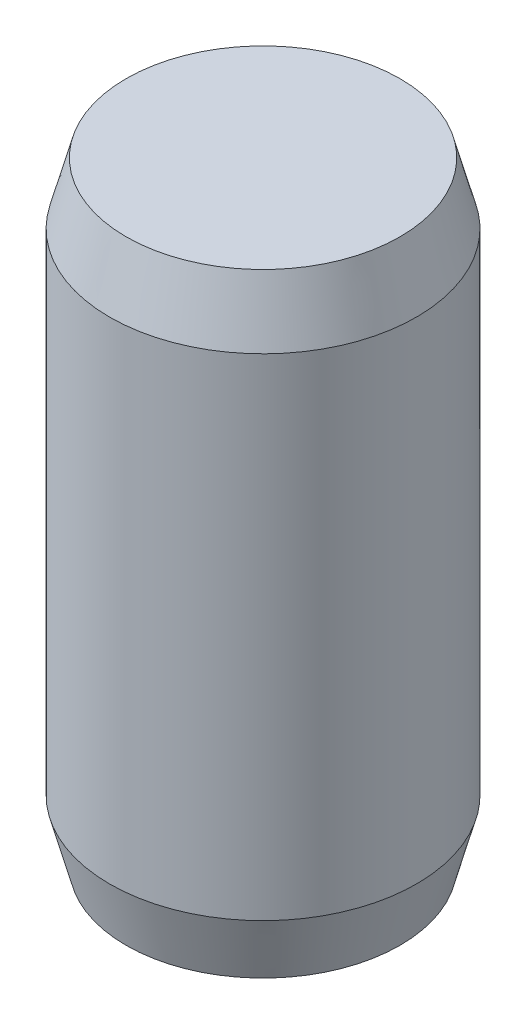
ISO-10303-21;
HEADER;
FILE_DESCRIPTION(('STEP AP214'),'2;1');
FILE_NAME('part.step','',(''),(''),'','','');
FILE_SCHEMA(('AUTOMOTIVE_DESIGN { 1 0 10303 214 1 1 1 1 }'));
ENDSEC;
DATA;
#1=APPLICATION_CONTEXT('core data for automotive mechanical design processes');
#2=APPLICATION_PROTOCOL_DEFINITION('international standard','automotive_design',2000,#1);
#3=PRODUCT_CONTEXT('',#1,'mechanical');
#4=PRODUCT('Part','Part','',(#3));
#5=PRODUCT_RELATED_PRODUCT_CATEGORY('part','',(#4));
#6=PRODUCT_DEFINITION_FORMATION('','',#4);
#7=PRODUCT_DEFINITION_CONTEXT('part definition',#1,'design');
#8=PRODUCT_DEFINITION('design','',#6,#7);
#9=PRODUCT_DEFINITION_SHAPE('','',#8);
#10=(LENGTH_UNIT() NAMED_UNIT(*) SI_UNIT(.MILLI.,.METRE.));
#11=(NAMED_UNIT(*) PLANE_ANGLE_UNIT() SI_UNIT($,.RADIAN.));
#12=(NAMED_UNIT(*) SI_UNIT($,.STERADIAN.) SOLID_ANGLE_UNIT());
#13=UNCERTAINTY_MEASURE_WITH_UNIT(LENGTH_MEASURE(1.E-05),#10,'distance_accuracy_value','');
#14=(GEOMETRIC_REPRESENTATION_CONTEXT(3) GLOBAL_UNCERTAINTY_ASSIGNED_CONTEXT((#13)) GLOBAL_UNIT_ASSIGNED_CONTEXT((#10,
#11,#12)) REPRESENTATION_CONTEXT('',''));
#15=CARTESIAN_POINT('',(0.,0.,0.));
#16=DIRECTION('',(0.,0.,1.));
#17=DIRECTION('',(1.,0.,0.));
#18=AXIS2_PLACEMENT_3D('',#15,#16,#17);
#19=CARTESIAN_POINT('',(0.,20.,0.));
#20=DIRECTION('',(0.,-1.,0.));
#21=DIRECTION('',(0.,0.,-1.));
#22=AXIS2_PLACEMENT_3D('',#19,#20,#21);
#23=CYLINDRICAL_SURFACE('',#22,5.);
#24=CARTESIAN_POINT('',(0.,2.00000000000002,0.));
#25=DIRECTION('',(0.,1.,0.));
#26=DIRECTION('',(0.,0.,1.));
#27=AXIS2_PLACEMENT_3D('',#24,#25,#26);
#28=CIRCLE('',#27,5.);
#29=CARTESIAN_POINT('',(0.,2.00000000000002,5.));
#30=VERTEX_POINT('',#29);
#31=EDGE_CURVE('E45',#30,#30,#28,.T.);
#32=ORIENTED_EDGE('',*,*,#31,.T.);
#33=EDGE_LOOP('',(#32));
#34=FACE_BOUND('',#33,.T.);
#35=CARTESIAN_POINT('',(0.,18.,0.));
#36=DIRECTION('',(0.,1.,0.));
#37=DIRECTION('',(0.,0.,1.));
#38=AXIS2_PLACEMENT_3D('',#35,#36,#37);
#39=CIRCLE('',#38,5.);
#40=CARTESIAN_POINT('',(0.,18.,5.));
#41=VERTEX_POINT('',#40);
#42=EDGE_CURVE('E50',#41,#41,#39,.F.);
#43=ORIENTED_EDGE('',*,*,#42,.T.);
#44=EDGE_LOOP('',(#43));
#45=FACE_BOUND('',#44,.T.);
#46=ADVANCED_FACE('F37',(#34,#45),#23,.T.);
#47=CARTESIAN_POINT('',(0.,20.,0.));
#48=DIRECTION('',(0.,1.,0.));
#49=DIRECTION('',(0.,0.,1.));
#50=AXIS2_PLACEMENT_3D('',#47,#48,#49);
#51=PLANE('',#50);
#52=CARTESIAN_POINT('',(0.,20.,0.));
#53=DIRECTION('',(0.,1.,0.));
#54=DIRECTION('',(0.,0.,1.));
#55=AXIS2_PLACEMENT_3D('',#52,#53,#54);
#56=CIRCLE('',#55,4.46410161513775);
#57=CARTESIAN_POINT('',(0.,20.,4.46410161513775));
#58=VERTEX_POINT('',#57);
#59=EDGE_CURVE('E55',#58,#58,#56,.T.);
#60=ORIENTED_EDGE('',*,*,#59,.T.);
#61=EDGE_LOOP('',(#60));
#62=FACE_BOUND('',#61,.T.);
#63=ADVANCED_FACE('F62',(#62),#51,.T.);
#64=CARTESIAN_POINT('',(0.,0.,0.));
#65=DIRECTION('',(0.,1.,0.));
#66=DIRECTION('',(0.,0.,1.));
#67=AXIS2_PLACEMENT_3D('',#64,#65,#66);
#68=PLANE('',#67);
#69=CARTESIAN_POINT('',(0.,0.,0.));
#70=DIRECTION('',(0.,1.,0.));
#71=DIRECTION('',(0.,0.,1.));
#72=AXIS2_PLACEMENT_3D('',#69,#70,#71);
#73=CIRCLE('',#72,4.46410161513776);
#74=CARTESIAN_POINT('',(0.,0.,4.46410161513776));
#75=VERTEX_POINT('',#74);
#76=EDGE_CURVE('E10',#75,#75,#73,.F.);
#77=ORIENTED_EDGE('',*,*,#76,.T.);
#78=EDGE_LOOP('',(#77));
#79=FACE_BOUND('',#78,.T.);
#80=ADVANCED_FACE('F66',(#79),#68,.F.);
#81=CARTESIAN_POINT('',(0.,20.,0.));
#82=DIRECTION('',(0.,-1.,0.));
#83=DIRECTION('',(0.,0.,-1.));
#84=AXIS2_PLACEMENT_3D('',#81,#82,#83);
#85=CONICAL_SURFACE('',#84,4.46410161513775,0.261799387799146);
#86=ORIENTED_EDGE('',*,*,#42,.F.);
#87=EDGE_LOOP('',(#86));
#88=FACE_BOUND('',#87,.T.);
#89=ORIENTED_EDGE('',*,*,#59,.F.);
#90=EDGE_LOOP('',(#89));
#91=FACE_BOUND('',#90,.T.);
#92=ADVANCED_FACE('F64',(#88,#91),#85,.T.);
#93=CARTESIAN_POINT('',(0.,2.00000000000002,0.));
#94=DIRECTION('',(0.,1.,0.));
#95=DIRECTION('',(0.,0.,1.));
#96=AXIS2_PLACEMENT_3D('',#93,#94,#95);
#97=CONICAL_SURFACE('',#96,5.,0.261799387799147);
#98=ORIENTED_EDGE('',*,*,#76,.F.);
#99=EDGE_LOOP('',(#98));
#100=FACE_BOUND('',#99,.T.);
#101=ORIENTED_EDGE('',*,*,#31,.F.);
#102=EDGE_LOOP('',(#101));
#103=FACE_BOUND('',#102,.T.);
#104=ADVANCED_FACE('F39',(#100,#103),#97,.T.);
#105=CLOSED_SHELL('',(#46,#63,#80,#92,#104));
#106=MANIFOLD_SOLID_BREP('B2',#105);
#107=ADVANCED_BREP_SHAPE_REPRESENTATION('',(#18,#106),#14);
#108=SHAPE_DEFINITION_REPRESENTATION(#9,#107);
ENDSEC;
END-ISO-10303-21;
